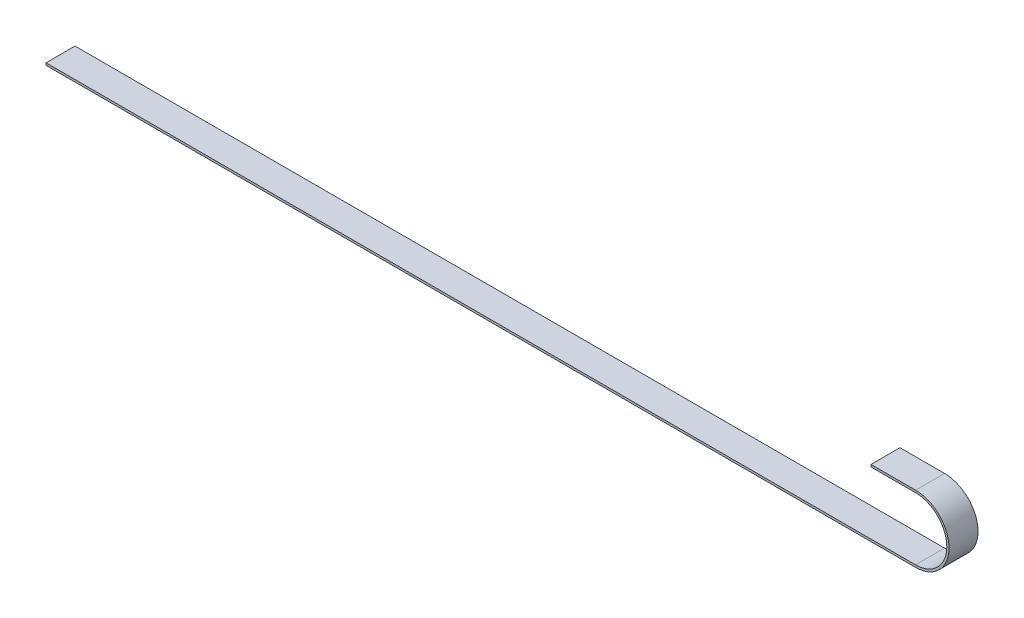
ISO-10303-21;
HEADER;
FILE_DESCRIPTION(('STEP AP214'),'2;1');
FILE_NAME('part.step','',(''),(''),'','','');
FILE_SCHEMA(('AUTOMOTIVE_DESIGN { 1 0 10303 214 1 1 1 1 }'));
ENDSEC;
DATA;
#1=APPLICATION_CONTEXT('core data for automotive mechanical design processes');
#2=APPLICATION_PROTOCOL_DEFINITION('international standard','automotive_design',2000,#1);
#3=PRODUCT_CONTEXT('',#1,'mechanical');
#4=PRODUCT('Part','Part','',(#3));
#5=PRODUCT_RELATED_PRODUCT_CATEGORY('part','',(#4));
#6=PRODUCT_DEFINITION_FORMATION('','',#4);
#7=PRODUCT_DEFINITION_CONTEXT('part definition',#1,'design');
#8=PRODUCT_DEFINITION('design','',#6,#7);
#9=PRODUCT_DEFINITION_SHAPE('','',#8);
#10=(LENGTH_UNIT() NAMED_UNIT(*) SI_UNIT(.MILLI.,.METRE.));
#11=(NAMED_UNIT(*) PLANE_ANGLE_UNIT() SI_UNIT($,.RADIAN.));
#12=(NAMED_UNIT(*) SI_UNIT($,.STERADIAN.) SOLID_ANGLE_UNIT());
#13=UNCERTAINTY_MEASURE_WITH_UNIT(LENGTH_MEASURE(1.E-05),#10,'distance_accuracy_value','');
#14=(GEOMETRIC_REPRESENTATION_CONTEXT(3) GLOBAL_UNCERTAINTY_ASSIGNED_CONTEXT((#13)) GLOBAL_UNIT_ASSIGNED_CONTEXT((#10,
#11,#12)) REPRESENTATION_CONTEXT('',''));
#15=CARTESIAN_POINT('',(0.,0.,0.));
#16=DIRECTION('',(0.,0.,1.));
#17=DIRECTION('',(1.,0.,0.));
#18=AXIS2_PLACEMENT_3D('',#15,#16,#17);
#19=CARTESIAN_POINT('',(390.,30.,6.5));
#20=DIRECTION('',(0.,-1.,0.));
#21=DIRECTION('',(1.,0.,0.));
#22=AXIS2_PLACEMENT_3D('',#19,#20,#21);
#23=PLANE('',#22);
#24=DIRECTION('',(-1.,0.,0.));
#25=VECTOR('',#24,1.);
#26=CARTESIAN_POINT('',(390.,30.,-6.5));
#27=LINE('',#26,#25);
#28=CARTESIAN_POINT('',(390.,30.,-6.5));
#29=VERTEX_POINT('',#28);
#30=CARTESIAN_POINT('',(370.,30.,-6.5));
#31=VERTEX_POINT('',#30);
#32=EDGE_CURVE('E129',#29,#31,#27,.T.);
#33=ORIENTED_EDGE('',*,*,#32,.T.);
#34=DIRECTION('',(0.,0.,-1.));
#35=VECTOR('',#34,1.);
#36=CARTESIAN_POINT('',(370.,30.,6.5));
#37=LINE('',#36,#35);
#38=CARTESIAN_POINT('',(370.,30.,6.5));
#39=VERTEX_POINT('',#38);
#40=EDGE_CURVE('E11',#39,#31,#37,.T.);
#41=ORIENTED_EDGE('',*,*,#40,.F.);
#42=DIRECTION('',(-1.,0.,0.));
#43=VECTOR('',#42,1.);
#44=CARTESIAN_POINT('',(390.,30.,6.5));
#45=LINE('',#44,#43);
#46=CARTESIAN_POINT('',(390.,30.,6.5));
#47=VERTEX_POINT('',#46);
#48=EDGE_CURVE('E87',#47,#39,#45,.T.);
#49=ORIENTED_EDGE('',*,*,#48,.F.);
#50=DIRECTION('',(0.,0.,-1.));
#51=VECTOR('',#50,1.);
#52=CARTESIAN_POINT('',(390.,30.,6.5));
#53=LINE('',#52,#51);
#54=EDGE_CURVE('E128',#47,#29,#53,.T.);
#55=ORIENTED_EDGE('',*,*,#54,.T.);
#56=EDGE_LOOP('',(#33,#41,#49,#55));
#57=FACE_BOUND('',#56,.T.);
#58=ADVANCED_FACE('F32',(#57),#23,.F.);
#59=CARTESIAN_POINT('',(370.,29.,6.5));
#60=DIRECTION('',(-1.,0.,0.));
#61=DIRECTION('',(0.,0.,1.));
#62=AXIS2_PLACEMENT_3D('',#59,#60,#61);
#63=PLANE('',#62);
#64=DIRECTION('',(0.,1.,0.));
#65=VECTOR('',#64,1.);
#66=CARTESIAN_POINT('',(370.,29.,-6.5));
#67=LINE('',#66,#65);
#68=CARTESIAN_POINT('',(370.,29.,-6.5));
#69=VERTEX_POINT('',#68);
#70=EDGE_CURVE('E132',#69,#31,#67,.T.);
#71=ORIENTED_EDGE('',*,*,#70,.F.);
#72=DIRECTION('',(0.,0.,-1.));
#73=VECTOR('',#72,1.);
#74=CARTESIAN_POINT('',(370.,29.,6.5));
#75=LINE('',#74,#73);
#76=CARTESIAN_POINT('',(370.,29.,6.5));
#77=VERTEX_POINT('',#76);
#78=EDGE_CURVE('E40',#77,#69,#75,.T.);
#79=ORIENTED_EDGE('',*,*,#78,.F.);
#80=DIRECTION('',(0.,1.,0.));
#81=VECTOR('',#80,1.);
#82=CARTESIAN_POINT('',(370.,29.,6.5));
#83=LINE('',#82,#81);
#84=EDGE_CURVE('E171',#77,#39,#83,.T.);
#85=ORIENTED_EDGE('',*,*,#84,.T.);
#86=ORIENTED_EDGE('',*,*,#40,.T.);
#87=EDGE_LOOP('',(#71,#79,#85,#86));
#88=FACE_BOUND('',#87,.T.);
#89=ADVANCED_FACE('F162',(#88),#63,.T.);
#90=CARTESIAN_POINT('',(390.,29.,6.5));
#91=DIRECTION('',(0.,-1.,0.));
#92=DIRECTION('',(1.,0.,0.));
#93=AXIS2_PLACEMENT_3D('',#90,#91,#92);
#94=PLANE('',#93);
#95=DIRECTION('',(-1.,0.,0.));
#96=VECTOR('',#95,1.);
#97=CARTESIAN_POINT('',(390.,29.,-6.5));
#98=LINE('',#97,#96);
#99=CARTESIAN_POINT('',(390.,29.,-6.5));
#100=VERTEX_POINT('',#99);
#101=EDGE_CURVE('E135',#100,#69,#98,.T.);
#102=ORIENTED_EDGE('',*,*,#101,.F.);
#103=DIRECTION('',(0.,0.,-1.));
#104=VECTOR('',#103,1.);
#105=CARTESIAN_POINT('',(390.,29.,6.5));
#106=LINE('',#105,#104);
#107=CARTESIAN_POINT('',(390.,29.,6.5));
#108=VERTEX_POINT('',#107);
#109=EDGE_CURVE('E152',#108,#100,#106,.T.);
#110=ORIENTED_EDGE('',*,*,#109,.F.);
#111=DIRECTION('',(-1.,0.,0.));
#112=VECTOR('',#111,1.);
#113=CARTESIAN_POINT('',(390.,29.,6.5));
#114=LINE('',#113,#112);
#115=EDGE_CURVE('E159',#108,#77,#114,.T.);
#116=ORIENTED_EDGE('',*,*,#115,.T.);
#117=ORIENTED_EDGE('',*,*,#78,.T.);
#118=EDGE_LOOP('',(#102,#110,#116,#117));
#119=FACE_BOUND('',#118,.T.);
#120=ADVANCED_FACE('F157',(#119),#94,.T.);
#121=CARTESIAN_POINT('',(390.,15.,6.5));
#122=DIRECTION('',(0.,0.,-1.));
#123=DIRECTION('',(-1.,0.,0.));
#124=AXIS2_PLACEMENT_3D('',#121,#122,#123);
#125=CYLINDRICAL_SURFACE('',#124,14.);
#126=CARTESIAN_POINT('',(390.,15.,-6.5));
#127=DIRECTION('',(0.,0.,1.));
#128=DIRECTION('',(1.,0.,0.));
#129=AXIS2_PLACEMENT_3D('',#126,#127,#128);
#130=CIRCLE('',#129,14.);
#131=CARTESIAN_POINT('',(390.,1.,-6.5));
#132=VERTEX_POINT('',#131);
#133=EDGE_CURVE('E138',#132,#100,#130,.T.);
#134=ORIENTED_EDGE('',*,*,#133,.F.);
#135=DIRECTION('',(0.,0.,-1.));
#136=VECTOR('',#135,1.);
#137=CARTESIAN_POINT('',(390.,1.,6.5));
#138=LINE('',#137,#136);
#139=CARTESIAN_POINT('',(390.,1.,6.5));
#140=VERTEX_POINT('',#139);
#141=EDGE_CURVE('E150',#140,#132,#138,.T.);
#142=ORIENTED_EDGE('',*,*,#141,.F.);
#143=CARTESIAN_POINT('',(390.,15.,6.5));
#144=DIRECTION('',(0.,0.,1.));
#145=DIRECTION('',(1.,0.,0.));
#146=AXIS2_PLACEMENT_3D('',#143,#144,#145);
#147=CIRCLE('',#146,14.);
#148=EDGE_CURVE('E123',#140,#108,#147,.T.);
#149=ORIENTED_EDGE('',*,*,#148,.T.);
#150=ORIENTED_EDGE('',*,*,#109,.T.);
#151=EDGE_LOOP('',(#134,#142,#149,#150));
#152=FACE_BOUND('',#151,.T.);
#153=ADVANCED_FACE('F169',(#152),#125,.F.);
#154=CARTESIAN_POINT('',(0.,1.,6.5));
#155=DIRECTION('',(0.,1.,0.));
#156=DIRECTION('',(0.,0.,1.));
#157=AXIS2_PLACEMENT_3D('',#154,#155,#156);
#158=PLANE('',#157);
#159=DIRECTION('',(1.,0.,0.));
#160=VECTOR('',#159,1.);
#161=CARTESIAN_POINT('',(0.,1.,-6.5));
#162=LINE('',#161,#160);
#163=CARTESIAN_POINT('',(0.,1.,-6.5));
#164=VERTEX_POINT('',#163);
#165=EDGE_CURVE('E141',#164,#132,#162,.T.);
#166=ORIENTED_EDGE('',*,*,#165,.F.);
#167=DIRECTION('',(0.,0.,-1.));
#168=VECTOR('',#167,1.);
#169=CARTESIAN_POINT('',(0.,1.,6.5));
#170=LINE('',#169,#168);
#171=CARTESIAN_POINT('',(0.,1.,6.5));
#172=VERTEX_POINT('',#171);
#173=EDGE_CURVE('E111',#172,#164,#170,.T.);
#174=ORIENTED_EDGE('',*,*,#173,.F.);
#175=DIRECTION('',(1.,0.,0.));
#176=VECTOR('',#175,1.);
#177=CARTESIAN_POINT('',(0.,1.,6.5));
#178=LINE('',#177,#176);
#179=EDGE_CURVE('E121',#172,#140,#178,.T.);
#180=ORIENTED_EDGE('',*,*,#179,.T.);
#181=ORIENTED_EDGE('',*,*,#141,.T.);
#182=EDGE_LOOP('',(#166,#174,#180,#181));
#183=FACE_BOUND('',#182,.T.);
#184=ADVANCED_FACE('F176',(#183),#158,.T.);
#185=CARTESIAN_POINT('',(0.,0.,6.5));
#186=DIRECTION('',(-1.,0.,0.));
#187=DIRECTION('',(0.,0.,1.));
#188=AXIS2_PLACEMENT_3D('',#185,#186,#187);
#189=PLANE('',#188);
#190=DIRECTION('',(0.,1.,0.));
#191=VECTOR('',#190,1.);
#192=CARTESIAN_POINT('',(0.,0.,-6.5));
#193=LINE('',#192,#191);
#194=CARTESIAN_POINT('',(0.,0.,-6.5));
#195=VERTEX_POINT('',#194);
#196=EDGE_CURVE('E110',#195,#164,#193,.T.);
#197=ORIENTED_EDGE('',*,*,#196,.F.);
#198=DIRECTION('',(0.,0.,-1.));
#199=VECTOR('',#198,1.);
#200=CARTESIAN_POINT('',(0.,0.,6.5));
#201=LINE('',#200,#199);
#202=CARTESIAN_POINT('',(0.,0.,6.5));
#203=VERTEX_POINT('',#202);
#204=EDGE_CURVE('E104',#203,#195,#201,.T.);
#205=ORIENTED_EDGE('',*,*,#204,.F.);
#206=DIRECTION('',(0.,1.,0.));
#207=VECTOR('',#206,1.);
#208=CARTESIAN_POINT('',(0.,0.,6.5));
#209=LINE('',#208,#207);
#210=EDGE_CURVE('E108',#203,#172,#209,.T.);
#211=ORIENTED_EDGE('',*,*,#210,.T.);
#212=ORIENTED_EDGE('',*,*,#173,.T.);
#213=EDGE_LOOP('',(#197,#205,#211,#212));
#214=FACE_BOUND('',#213,.T.);
#215=ADVANCED_FACE('F106',(#214),#189,.T.);
#216=CARTESIAN_POINT('',(0.,0.,6.5));
#217=DIRECTION('',(0.,1.,0.));
#218=DIRECTION('',(0.,0.,1.));
#219=AXIS2_PLACEMENT_3D('',#216,#217,#218);
#220=PLANE('',#219);
#221=DIRECTION('',(1.,0.,0.));
#222=VECTOR('',#221,1.);
#223=CARTESIAN_POINT('',(0.,0.,-6.5));
#224=LINE('',#223,#222);
#225=CARTESIAN_POINT('',(390.,0.,-6.5));
#226=VERTEX_POINT('',#225);
#227=EDGE_CURVE('E75',#195,#226,#224,.T.);
#228=ORIENTED_EDGE('',*,*,#227,.T.);
#229=DIRECTION('',(0.,0.,-1.));
#230=VECTOR('',#229,1.);
#231=CARTESIAN_POINT('',(390.,0.,6.5));
#232=LINE('',#231,#230);
#233=CARTESIAN_POINT('',(390.,0.,6.5));
#234=VERTEX_POINT('',#233);
#235=EDGE_CURVE('E112',#234,#226,#232,.T.);
#236=ORIENTED_EDGE('',*,*,#235,.F.);
#237=DIRECTION('',(1.,0.,0.));
#238=VECTOR('',#237,1.);
#239=CARTESIAN_POINT('',(0.,0.,6.5));
#240=LINE('',#239,#238);
#241=EDGE_CURVE('E114',#203,#234,#240,.T.);
#242=ORIENTED_EDGE('',*,*,#241,.F.);
#243=ORIENTED_EDGE('',*,*,#204,.T.);
#244=EDGE_LOOP('',(#228,#236,#242,#243));
#245=FACE_BOUND('',#244,.T.);
#246=ADVANCED_FACE('F115',(#245),#220,.F.);
#247=CARTESIAN_POINT('',(390.,15.,6.5));
#248=DIRECTION('',(0.,0.,-1.));
#249=DIRECTION('',(-1.,0.,0.));
#250=AXIS2_PLACEMENT_3D('',#247,#248,#249);
#251=CYLINDRICAL_SURFACE('',#250,15.);
#252=CARTESIAN_POINT('',(390.,15.,-6.5));
#253=DIRECTION('',(0.,0.,1.));
#254=DIRECTION('',(1.,0.,0.));
#255=AXIS2_PLACEMENT_3D('',#252,#253,#254);
#256=CIRCLE('',#255,15.);
#257=EDGE_CURVE('E81',#226,#29,#256,.T.);
#258=ORIENTED_EDGE('',*,*,#257,.T.);
#259=ORIENTED_EDGE('',*,*,#54,.F.);
#260=CARTESIAN_POINT('',(390.,15.,6.5));
#261=DIRECTION('',(0.,0.,1.));
#262=DIRECTION('',(1.,0.,0.));
#263=AXIS2_PLACEMENT_3D('',#260,#261,#262);
#264=CIRCLE('',#263,15.);
#265=EDGE_CURVE('E48',#234,#47,#264,.T.);
#266=ORIENTED_EDGE('',*,*,#265,.F.);
#267=ORIENTED_EDGE('',*,*,#235,.T.);
#268=EDGE_LOOP('',(#258,#259,#266,#267));
#269=FACE_BOUND('',#268,.T.);
#270=ADVANCED_FACE('F178',(#269),#251,.T.);
#271=CARTESIAN_POINT('',(390.,15.,6.5));
#272=DIRECTION('',(0.,0.,1.));
#273=DIRECTION('',(1.,0.,0.));
#274=AXIS2_PLACEMENT_3D('',#271,#272,#273);
#275=PLANE('',#274);
#276=ORIENTED_EDGE('',*,*,#48,.T.);
#277=ORIENTED_EDGE('',*,*,#84,.F.);
#278=ORIENTED_EDGE('',*,*,#115,.F.);
#279=ORIENTED_EDGE('',*,*,#148,.F.);
#280=ORIENTED_EDGE('',*,*,#179,.F.);
#281=ORIENTED_EDGE('',*,*,#210,.F.);
#282=ORIENTED_EDGE('',*,*,#241,.T.);
#283=ORIENTED_EDGE('',*,*,#265,.T.);
#284=EDGE_LOOP('',(#276,#277,#278,#279,#280,#281,#282,#283));
#285=FACE_BOUND('',#284,.T.);
#286=ADVANCED_FACE('F118',(#285),#275,.T.);
#287=CARTESIAN_POINT('',(390.,15.,-6.5));
#288=DIRECTION('',(0.,0.,1.));
#289=DIRECTION('',(1.,0.,0.));
#290=AXIS2_PLACEMENT_3D('',#287,#288,#289);
#291=PLANE('',#290);
#292=ORIENTED_EDGE('',*,*,#32,.F.);
#293=ORIENTED_EDGE('',*,*,#257,.F.);
#294=ORIENTED_EDGE('',*,*,#227,.F.);
#295=ORIENTED_EDGE('',*,*,#196,.T.);
#296=ORIENTED_EDGE('',*,*,#165,.T.);
#297=ORIENTED_EDGE('',*,*,#133,.T.);
#298=ORIENTED_EDGE('',*,*,#101,.T.);
#299=ORIENTED_EDGE('',*,*,#70,.T.);
#300=EDGE_LOOP('',(#292,#293,#294,#295,#296,#297,#298,#299));
#301=FACE_BOUND('',#300,.T.);
#302=ADVANCED_FACE('F165',(#301),#291,.F.);
#303=CLOSED_SHELL('',(#58,#89,#120,#153,#184,#215,#246,#270,#286,#302));
#304=MANIFOLD_SOLID_BREP('B2',#303);
#305=ADVANCED_BREP_SHAPE_REPRESENTATION('',(#18,#304),#14);
#306=SHAPE_DEFINITION_REPRESENTATION(#9,#305);
ENDSEC;
END-ISO-10303-21;
